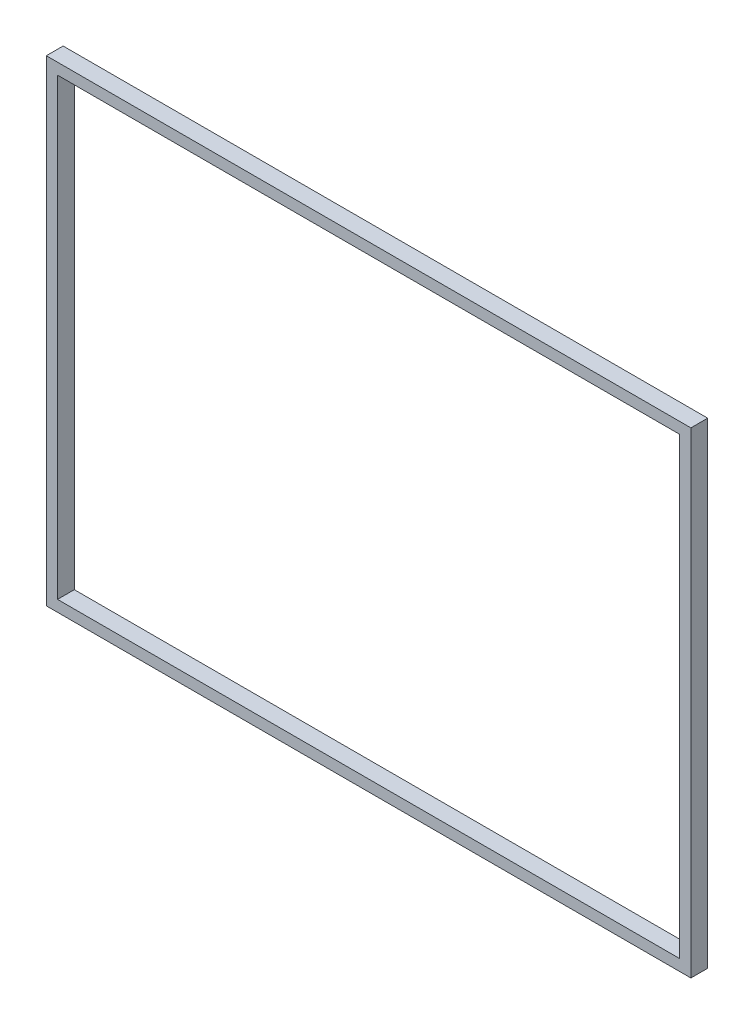
ISO-10303-21;
HEADER;
FILE_DESCRIPTION(('STEP AP214'),'2;1');
FILE_NAME('part.step','',(''),(''),'','','');
FILE_SCHEMA(('AUTOMOTIVE_DESIGN { 1 0 10303 214 1 1 1 1 }'));
ENDSEC;
DATA;
#1=APPLICATION_CONTEXT('core data for automotive mechanical design processes');
#2=APPLICATION_PROTOCOL_DEFINITION('international standard','automotive_design',2000,#1);
#3=PRODUCT_CONTEXT('',#1,'mechanical');
#4=PRODUCT('Part','Part','',(#3));
#5=PRODUCT_RELATED_PRODUCT_CATEGORY('part','',(#4));
#6=PRODUCT_DEFINITION_FORMATION('','',#4);
#7=PRODUCT_DEFINITION_CONTEXT('part definition',#1,'design');
#8=PRODUCT_DEFINITION('design','',#6,#7);
#9=PRODUCT_DEFINITION_SHAPE('','',#8);
#10=(LENGTH_UNIT() NAMED_UNIT(*) SI_UNIT(.MILLI.,.METRE.));
#11=(NAMED_UNIT(*) PLANE_ANGLE_UNIT() SI_UNIT($,.RADIAN.));
#12=(NAMED_UNIT(*) SI_UNIT($,.STERADIAN.) SOLID_ANGLE_UNIT());
#13=UNCERTAINTY_MEASURE_WITH_UNIT(LENGTH_MEASURE(1.E-05),#10,'distance_accuracy_value','');
#14=(GEOMETRIC_REPRESENTATION_CONTEXT(3) GLOBAL_UNCERTAINTY_ASSIGNED_CONTEXT((#13)) GLOBAL_UNIT_ASSIGNED_CONTEXT((#10,
#11,#12)) REPRESENTATION_CONTEXT('',''));
#15=CARTESIAN_POINT('',(0.,0.,0.));
#16=DIRECTION('',(0.,0.,1.));
#17=DIRECTION('',(1.,0.,0.));
#18=AXIS2_PLACEMENT_3D('',#15,#16,#17);
#19=CARTESIAN_POINT('',(0.,0.,3.));
#20=DIRECTION('',(0.,0.,1.));
#21=DIRECTION('',(1.,0.,0.));
#22=AXIS2_PLACEMENT_3D('',#19,#20,#21);
#23=PLANE('',#22);
#24=DIRECTION('',(0.,-1.,0.));
#25=VECTOR('',#24,1.);
#26=CARTESIAN_POINT('',(-78.5209028334341,35.7825095344714,3.));
#27=LINE('',#26,#25);
#28=CARTESIAN_POINT('',(-78.5209028334341,35.7825095344714,3.));
#29=VERTEX_POINT('',#28);
#30=CARTESIAN_POINT('',(-78.5209028334341,-49.2174904655286,3.));
#31=VERTEX_POINT('',#30);
#32=EDGE_CURVE('E135',#29,#31,#27,.T.);
#33=ORIENTED_EDGE('',*,*,#32,.T.);
#34=DIRECTION('',(1.,0.,0.));
#35=VECTOR('',#34,1.);
#36=CARTESIAN_POINT('',(-78.5209028334341,-49.2174904655286,3.));
#37=LINE('',#36,#35);
#38=CARTESIAN_POINT('',(36.4790971665659,-49.2174904655286,3.));
#39=VERTEX_POINT('',#38);
#40=EDGE_CURVE('E138',#31,#39,#37,.T.);
#41=ORIENTED_EDGE('',*,*,#40,.T.);
#42=DIRECTION('',(0.,1.,0.));
#43=VECTOR('',#42,1.);
#44=CARTESIAN_POINT('',(36.4790971665659,35.7825095344714,3.));
#45=LINE('',#44,#43);
#46=CARTESIAN_POINT('',(36.4790971665659,35.7825095344714,3.));
#47=VERTEX_POINT('',#46);
#48=EDGE_CURVE('E141',#39,#47,#45,.T.);
#49=ORIENTED_EDGE('',*,*,#48,.T.);
#50=DIRECTION('',(-1.,0.,0.));
#51=VECTOR('',#50,1.);
#52=CARTESIAN_POINT('',(-78.5209028334341,35.7825095344714,3.));
#53=LINE('',#52,#51);
#54=EDGE_CURVE('E143',#47,#29,#53,.T.);
#55=ORIENTED_EDGE('',*,*,#54,.T.);
#56=EDGE_LOOP('',(#33,#41,#49,#55));
#57=FACE_BOUND('',#56,.T.);
#58=DIRECTION('',(1.,0.,0.));
#59=VECTOR('',#58,1.);
#60=CARTESIAN_POINT('',(-76.5209028334341,-47.2174904655286,3.));
#61=LINE('',#60,#59);
#62=CARTESIAN_POINT('',(-76.5209028334341,-47.2174904655286,3.));
#63=VERTEX_POINT('',#62);
#64=CARTESIAN_POINT('',(34.4790971665659,-47.2174904655286,3.));
#65=VERTEX_POINT('',#64);
#66=EDGE_CURVE('E107',#63,#65,#61,.T.);
#67=ORIENTED_EDGE('',*,*,#66,.F.);
#68=DIRECTION('',(0.,-1.,0.));
#69=VECTOR('',#68,1.);
#70=CARTESIAN_POINT('',(-76.5209028334341,33.7825095344714,3.));
#71=LINE('',#70,#69);
#72=CARTESIAN_POINT('',(-76.5209028334341,33.7825095344714,3.));
#73=VERTEX_POINT('',#72);
#74=EDGE_CURVE('E99',#73,#63,#71,.T.);
#75=ORIENTED_EDGE('',*,*,#74,.F.);
#76=DIRECTION('',(-1.,0.,0.));
#77=VECTOR('',#76,1.);
#78=CARTESIAN_POINT('',(-76.5209028334341,33.7825095344714,3.));
#79=LINE('',#78,#77);
#80=CARTESIAN_POINT('',(34.4790971665659,33.7825095344714,3.));
#81=VERTEX_POINT('',#80);
#82=EDGE_CURVE('E121',#81,#73,#79,.T.);
#83=ORIENTED_EDGE('',*,*,#82,.F.);
#84=DIRECTION('',(0.,1.,0.));
#85=VECTOR('',#84,1.);
#86=CARTESIAN_POINT('',(34.4790971665659,33.7825095344714,3.));
#87=LINE('',#86,#85);
#88=EDGE_CURVE('E119',#65,#81,#87,.T.);
#89=ORIENTED_EDGE('',*,*,#88,.F.);
#90=EDGE_LOOP('',(#67,#75,#83,#89));
#91=FACE_BOUND('',#90,.T.);
#92=ADVANCED_FACE('F34',(#57,#91),#23,.T.);
#93=CARTESIAN_POINT('',(0.,0.,0.));
#94=DIRECTION('',(0.,0.,1.));
#95=DIRECTION('',(1.,0.,0.));
#96=AXIS2_PLACEMENT_3D('',#93,#94,#95);
#97=PLANE('',#96);
#98=DIRECTION('',(0.,-1.,0.));
#99=VECTOR('',#98,1.);
#100=CARTESIAN_POINT('',(-78.5209028334341,35.7825095344714,0.));
#101=LINE('',#100,#99);
#102=CARTESIAN_POINT('',(-78.5209028334341,35.7825095344714,0.));
#103=VERTEX_POINT('',#102);
#104=CARTESIAN_POINT('',(-78.5209028334341,-49.2174904655286,0.));
#105=VERTEX_POINT('',#104);
#106=EDGE_CURVE('E115',#103,#105,#101,.T.);
#107=ORIENTED_EDGE('',*,*,#106,.F.);
#108=DIRECTION('',(-1.,0.,0.));
#109=VECTOR('',#108,1.);
#110=CARTESIAN_POINT('',(-78.5209028334341,35.7825095344714,0.));
#111=LINE('',#110,#109);
#112=CARTESIAN_POINT('',(36.4790971665659,35.7825095344714,0.));
#113=VERTEX_POINT('',#112);
#114=EDGE_CURVE('E139',#113,#103,#111,.T.);
#115=ORIENTED_EDGE('',*,*,#114,.F.);
#116=DIRECTION('',(0.,1.,0.));
#117=VECTOR('',#116,1.);
#118=CARTESIAN_POINT('',(36.4790971665659,35.7825095344714,0.));
#119=LINE('',#118,#117);
#120=CARTESIAN_POINT('',(36.4790971665659,-49.2174904655286,0.));
#121=VERTEX_POINT('',#120);
#122=EDGE_CURVE('E150',#121,#113,#119,.T.);
#123=ORIENTED_EDGE('',*,*,#122,.F.);
#124=DIRECTION('',(1.,0.,0.));
#125=VECTOR('',#124,1.);
#126=CARTESIAN_POINT('',(-78.5209028334341,-49.2174904655286,0.));
#127=LINE('',#126,#125);
#128=EDGE_CURVE('E148',#105,#121,#127,.T.);
#129=ORIENTED_EDGE('',*,*,#128,.F.);
#130=EDGE_LOOP('',(#107,#115,#123,#129));
#131=FACE_BOUND('',#130,.T.);
#132=DIRECTION('',(0.,-1.,0.));
#133=VECTOR('',#132,1.);
#134=CARTESIAN_POINT('',(-76.5209028334341,33.7825095344714,0.));
#135=LINE('',#134,#133);
#136=CARTESIAN_POINT('',(-76.5209028334341,33.7825095344714,0.));
#137=VERTEX_POINT('',#136);
#138=CARTESIAN_POINT('',(-76.5209028334341,-47.2174904655286,0.));
#139=VERTEX_POINT('',#138);
#140=EDGE_CURVE('E57',#137,#139,#135,.T.);
#141=ORIENTED_EDGE('',*,*,#140,.T.);
#142=DIRECTION('',(1.,0.,0.));
#143=VECTOR('',#142,1.);
#144=CARTESIAN_POINT('',(-76.5209028334341,-47.2174904655286,0.));
#145=LINE('',#144,#143);
#146=CARTESIAN_POINT('',(34.4790971665659,-47.2174904655286,0.));
#147=VERTEX_POINT('',#146);
#148=EDGE_CURVE('E114',#139,#147,#145,.T.);
#149=ORIENTED_EDGE('',*,*,#148,.T.);
#150=DIRECTION('',(0.,1.,0.));
#151=VECTOR('',#150,1.);
#152=CARTESIAN_POINT('',(34.4790971665659,33.7825095344714,0.));
#153=LINE('',#152,#151);
#154=CARTESIAN_POINT('',(34.4790971665659,33.7825095344714,0.));
#155=VERTEX_POINT('',#154);
#156=EDGE_CURVE('E127',#147,#155,#153,.T.);
#157=ORIENTED_EDGE('',*,*,#156,.T.);
#158=DIRECTION('',(-1.,0.,0.));
#159=VECTOR('',#158,1.);
#160=CARTESIAN_POINT('',(-76.5209028334341,33.7825095344714,0.));
#161=LINE('',#160,#159);
#162=EDGE_CURVE('E108',#155,#137,#161,.T.);
#163=ORIENTED_EDGE('',*,*,#162,.T.);
#164=EDGE_LOOP('',(#141,#149,#157,#163));
#165=FACE_BOUND('',#164,.T.);
#166=ADVANCED_FACE('F168',(#131,#165),#97,.F.);
#167=CARTESIAN_POINT('',(-78.5209028334341,35.7825095344714,3.));
#168=DIRECTION('',(1.,0.,0.));
#169=DIRECTION('',(0.,1.,0.));
#170=AXIS2_PLACEMENT_3D('',#167,#168,#169);
#171=PLANE('',#170);
#172=ORIENTED_EDGE('',*,*,#106,.T.);
#173=DIRECTION('',(0.,0.,-1.));
#174=VECTOR('',#173,1.);
#175=CARTESIAN_POINT('',(-78.5209028334341,-49.2174904655286,3.));
#176=LINE('',#175,#174);
#177=EDGE_CURVE('E11',#31,#105,#176,.T.);
#178=ORIENTED_EDGE('',*,*,#177,.F.);
#179=ORIENTED_EDGE('',*,*,#32,.F.);
#180=DIRECTION('',(0.,0.,-1.));
#181=VECTOR('',#180,1.);
#182=CARTESIAN_POINT('',(-78.5209028334341,35.7825095344714,3.));
#183=LINE('',#182,#181);
#184=EDGE_CURVE('E145',#29,#103,#183,.T.);
#185=ORIENTED_EDGE('',*,*,#184,.T.);
#186=EDGE_LOOP('',(#172,#178,#179,#185));
#187=FACE_BOUND('',#186,.T.);
#188=ADVANCED_FACE('F36',(#187),#171,.F.);
#189=CARTESIAN_POINT('',(-78.5209028334341,-49.2174904655286,3.));
#190=DIRECTION('',(0.,1.,0.));
#191=DIRECTION('',(0.,0.,1.));
#192=AXIS2_PLACEMENT_3D('',#189,#190,#191);
#193=PLANE('',#192);
#194=ORIENTED_EDGE('',*,*,#128,.T.);
#195=DIRECTION('',(0.,0.,-1.));
#196=VECTOR('',#195,1.);
#197=CARTESIAN_POINT('',(36.4790971665659,-49.2174904655286,3.));
#198=LINE('',#197,#196);
#199=EDGE_CURVE('E42',#39,#121,#198,.T.);
#200=ORIENTED_EDGE('',*,*,#199,.F.);
#201=ORIENTED_EDGE('',*,*,#40,.F.);
#202=ORIENTED_EDGE('',*,*,#177,.T.);
#203=EDGE_LOOP('',(#194,#200,#201,#202));
#204=FACE_BOUND('',#203,.T.);
#205=ADVANCED_FACE('F178',(#204),#193,.F.);
#206=CARTESIAN_POINT('',(36.4790971665659,35.7825095344714,3.));
#207=DIRECTION('',(-1.,0.,0.));
#208=DIRECTION('',(0.,-1.,0.));
#209=AXIS2_PLACEMENT_3D('',#206,#207,#208);
#210=PLANE('',#209);
#211=ORIENTED_EDGE('',*,*,#122,.T.);
#212=DIRECTION('',(0.,0.,-1.));
#213=VECTOR('',#212,1.);
#214=CARTESIAN_POINT('',(36.4790971665659,35.7825095344714,3.));
#215=LINE('',#214,#213);
#216=EDGE_CURVE('E155',#47,#113,#215,.T.);
#217=ORIENTED_EDGE('',*,*,#216,.F.);
#218=ORIENTED_EDGE('',*,*,#48,.F.);
#219=ORIENTED_EDGE('',*,*,#199,.T.);
#220=EDGE_LOOP('',(#211,#217,#218,#219));
#221=FACE_BOUND('',#220,.T.);
#222=ADVANCED_FACE('F162',(#221),#210,.F.);
#223=CARTESIAN_POINT('',(-78.5209028334341,35.7825095344714,3.));
#224=DIRECTION('',(0.,-1.,0.));
#225=DIRECTION('',(0.,0.,-1.));
#226=AXIS2_PLACEMENT_3D('',#223,#224,#225);
#227=PLANE('',#226);
#228=ORIENTED_EDGE('',*,*,#114,.T.);
#229=ORIENTED_EDGE('',*,*,#184,.F.);
#230=ORIENTED_EDGE('',*,*,#54,.F.);
#231=ORIENTED_EDGE('',*,*,#216,.T.);
#232=EDGE_LOOP('',(#228,#229,#230,#231));
#233=FACE_BOUND('',#232,.T.);
#234=ADVANCED_FACE('F172',(#233),#227,.F.);
#235=CARTESIAN_POINT('',(-76.5209028334341,33.7825095344714,3.));
#236=DIRECTION('',(1.,0.,0.));
#237=DIRECTION('',(0.,1.,0.));
#238=AXIS2_PLACEMENT_3D('',#235,#236,#237);
#239=PLANE('',#238);
#240=ORIENTED_EDGE('',*,*,#140,.F.);
#241=DIRECTION('',(0.,0.,-1.));
#242=VECTOR('',#241,1.);
#243=CARTESIAN_POINT('',(-76.5209028334341,33.7825095344714,3.));
#244=LINE('',#243,#242);
#245=EDGE_CURVE('E103',#73,#137,#244,.T.);
#246=ORIENTED_EDGE('',*,*,#245,.F.);
#247=ORIENTED_EDGE('',*,*,#74,.T.);
#248=DIRECTION('',(0.,0.,-1.));
#249=VECTOR('',#248,1.);
#250=CARTESIAN_POINT('',(-76.5209028334341,-47.2174904655286,3.));
#251=LINE('',#250,#249);
#252=EDGE_CURVE('E102',#63,#139,#251,.T.);
#253=ORIENTED_EDGE('',*,*,#252,.T.);
#254=EDGE_LOOP('',(#240,#246,#247,#253));
#255=FACE_BOUND('',#254,.T.);
#256=ADVANCED_FACE('F101',(#255),#239,.T.);
#257=CARTESIAN_POINT('',(-76.5209028334341,-47.2174904655286,3.));
#258=DIRECTION('',(0.,1.,0.));
#259=DIRECTION('',(0.,0.,1.));
#260=AXIS2_PLACEMENT_3D('',#257,#258,#259);
#261=PLANE('',#260);
#262=ORIENTED_EDGE('',*,*,#148,.F.);
#263=ORIENTED_EDGE('',*,*,#252,.F.);
#264=ORIENTED_EDGE('',*,*,#66,.T.);
#265=DIRECTION('',(0.,0.,-1.));
#266=VECTOR('',#265,1.);
#267=CARTESIAN_POINT('',(34.4790971665659,-47.2174904655286,3.));
#268=LINE('',#267,#266);
#269=EDGE_CURVE('E116',#65,#147,#268,.T.);
#270=ORIENTED_EDGE('',*,*,#269,.T.);
#271=EDGE_LOOP('',(#262,#263,#264,#270));
#272=FACE_BOUND('',#271,.T.);
#273=ADVANCED_FACE('F111',(#272),#261,.T.);
#274=CARTESIAN_POINT('',(34.4790971665659,33.7825095344714,3.));
#275=DIRECTION('',(-1.,0.,0.));
#276=DIRECTION('',(0.,-1.,0.));
#277=AXIS2_PLACEMENT_3D('',#274,#275,#276);
#278=PLANE('',#277);
#279=ORIENTED_EDGE('',*,*,#156,.F.);
#280=ORIENTED_EDGE('',*,*,#269,.F.);
#281=ORIENTED_EDGE('',*,*,#88,.T.);
#282=DIRECTION('',(0.,0.,-1.));
#283=VECTOR('',#282,1.);
#284=CARTESIAN_POINT('',(34.4790971665659,33.7825095344714,3.));
#285=LINE('',#284,#283);
#286=EDGE_CURVE('E49',#81,#155,#285,.T.);
#287=ORIENTED_EDGE('',*,*,#286,.T.);
#288=EDGE_LOOP('',(#279,#280,#281,#287));
#289=FACE_BOUND('',#288,.T.);
#290=ADVANCED_FACE('F201',(#289),#278,.T.);
#291=CARTESIAN_POINT('',(-76.5209028334341,33.7825095344714,3.));
#292=DIRECTION('',(0.,-1.,0.));
#293=DIRECTION('',(0.,0.,-1.));
#294=AXIS2_PLACEMENT_3D('',#291,#292,#293);
#295=PLANE('',#294);
#296=ORIENTED_EDGE('',*,*,#162,.F.);
#297=ORIENTED_EDGE('',*,*,#286,.F.);
#298=ORIENTED_EDGE('',*,*,#82,.T.);
#299=ORIENTED_EDGE('',*,*,#245,.T.);
#300=EDGE_LOOP('',(#296,#297,#298,#299));
#301=FACE_BOUND('',#300,.T.);
#302=ADVANCED_FACE('F205',(#301),#295,.T.);
#303=CLOSED_SHELL('',(#92,#166,#188,#205,#222,#234,#256,#273,#290,#302));
#304=MANIFOLD_SOLID_BREP('B2',#303);
#305=ADVANCED_BREP_SHAPE_REPRESENTATION('',(#18,#304),#14);
#306=SHAPE_DEFINITION_REPRESENTATION(#9,#305);
ENDSEC;
END-ISO-10303-21;
